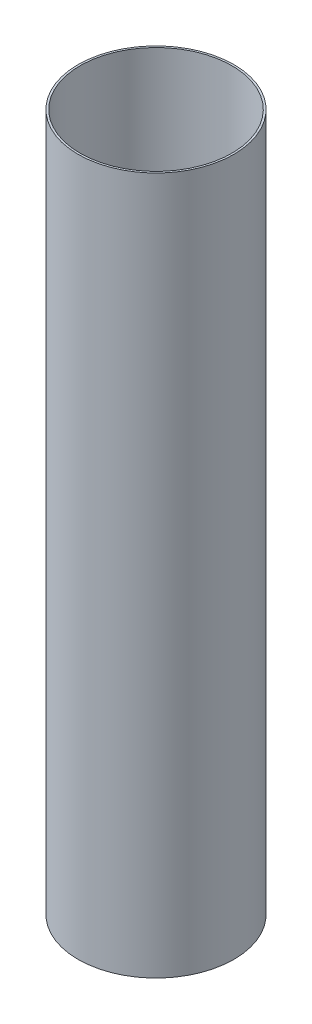
ISO-10303-21;
HEADER;
FILE_DESCRIPTION(('STEP AP214'),'2;1');
FILE_NAME('part.step','',(''),(''),'','','');
FILE_SCHEMA(('AUTOMOTIVE_DESIGN { 1 0 10303 214 1 1 1 1 }'));
ENDSEC;
DATA;
#1=APPLICATION_CONTEXT('core data for automotive mechanical design processes');
#2=APPLICATION_PROTOCOL_DEFINITION('international standard','automotive_design',2000,#1);
#3=PRODUCT_CONTEXT('',#1,'mechanical');
#4=PRODUCT('Part','Part','',(#3));
#5=PRODUCT_RELATED_PRODUCT_CATEGORY('part','',(#4));
#6=PRODUCT_DEFINITION_FORMATION('','',#4);
#7=PRODUCT_DEFINITION_CONTEXT('part definition',#1,'design');
#8=PRODUCT_DEFINITION('design','',#6,#7);
#9=PRODUCT_DEFINITION_SHAPE('','',#8);
#10=(LENGTH_UNIT() NAMED_UNIT(*) SI_UNIT(.MILLI.,.METRE.));
#11=(NAMED_UNIT(*) PLANE_ANGLE_UNIT() SI_UNIT($,.RADIAN.));
#12=(NAMED_UNIT(*) SI_UNIT($,.STERADIAN.) SOLID_ANGLE_UNIT());
#13=UNCERTAINTY_MEASURE_WITH_UNIT(LENGTH_MEASURE(1.E-05),#10,'distance_accuracy_value','');
#14=(GEOMETRIC_REPRESENTATION_CONTEXT(3) GLOBAL_UNCERTAINTY_ASSIGNED_CONTEXT((#13)) GLOBAL_UNIT_ASSIGNED_CONTEXT((#10,
#11,#12)) REPRESENTATION_CONTEXT('',''));
#15=CARTESIAN_POINT('',(0.,0.,0.));
#16=DIRECTION('',(0.,0.,1.));
#17=DIRECTION('',(1.,0.,0.));
#18=AXIS2_PLACEMENT_3D('',#15,#16,#17);
#19=CARTESIAN_POINT('',(76.2,0.,0.));
#20=DIRECTION('',(0.,1.,0.));
#21=DIRECTION('',(0.,0.,1.));
#22=AXIS2_PLACEMENT_3D('',#19,#20,#21);
#23=PLANE('',#22);
#24=CARTESIAN_POINT('',(0.,0.,0.));
#25=DIRECTION('',(0.,1.,0.));
#26=DIRECTION('',(0.,0.,1.));
#27=AXIS2_PLACEMENT_3D('',#24,#25,#26);
#28=CIRCLE('',#27,78.16);
#29=CARTESIAN_POINT('',(0.,0.,78.16));
#30=VERTEX_POINT('',#29);
#31=EDGE_CURVE('E10',#30,#30,#28,.T.);
#32=ORIENTED_EDGE('',*,*,#31,.F.);
#33=EDGE_LOOP('',(#32));
#34=FACE_BOUND('',#33,.T.);
#35=CARTESIAN_POINT('',(0.,0.,0.));
#36=DIRECTION('',(0.,1.,0.));
#37=DIRECTION('',(0.,0.,1.));
#38=AXIS2_PLACEMENT_3D('',#35,#36,#37);
#39=CIRCLE('',#38,76.2);
#40=CARTESIAN_POINT('',(0.,0.,76.2));
#41=VERTEX_POINT('',#40);
#42=EDGE_CURVE('E54',#41,#41,#39,.T.);
#43=ORIENTED_EDGE('',*,*,#42,.T.);
#44=EDGE_LOOP('',(#43));
#45=FACE_BOUND('',#44,.T.);
#46=ADVANCED_FACE('F37',(#34,#45),#23,.F.);
#47=CARTESIAN_POINT('',(0.,204.615384615384,0.));
#48=DIRECTION('',(0.,1.,0.));
#49=DIRECTION('',(0.,0.,1.));
#50=AXIS2_PLACEMENT_3D('',#47,#48,#49);
#51=CYLINDRICAL_SURFACE('',#50,78.16);
#52=CARTESIAN_POINT('',(0.,700.,0.));
#53=DIRECTION('',(0.,1.,0.));
#54=DIRECTION('',(0.,0.,1.));
#55=AXIS2_PLACEMENT_3D('',#52,#53,#54);
#56=CIRCLE('',#55,78.16);
#57=CARTESIAN_POINT('',(0.,700.,78.16));
#58=VERTEX_POINT('',#57);
#59=EDGE_CURVE('E44',#58,#58,#56,.T.);
#60=ORIENTED_EDGE('',*,*,#59,.F.);
#61=EDGE_LOOP('',(#60));
#62=FACE_BOUND('',#61,.T.);
#63=ORIENTED_EDGE('',*,*,#31,.T.);
#64=EDGE_LOOP('',(#63));
#65=FACE_BOUND('',#64,.T.);
#66=ADVANCED_FACE('F70',(#62,#65),#51,.T.);
#67=CARTESIAN_POINT('',(78.16,700.,0.));
#68=DIRECTION('',(0.,-1.,0.));
#69=DIRECTION('',(0.,0.,-1.));
#70=AXIS2_PLACEMENT_3D('',#67,#68,#69);
#71=PLANE('',#70);
#72=CARTESIAN_POINT('',(0.,700.,0.));
#73=DIRECTION('',(0.,1.,0.));
#74=DIRECTION('',(0.,0.,1.));
#75=AXIS2_PLACEMENT_3D('',#72,#73,#74);
#76=CIRCLE('',#75,76.2);
#77=CARTESIAN_POINT('',(0.,700.,76.2));
#78=VERTEX_POINT('',#77);
#79=EDGE_CURVE('E49',#78,#78,#76,.T.);
#80=ORIENTED_EDGE('',*,*,#79,.F.);
#81=EDGE_LOOP('',(#80));
#82=FACE_BOUND('',#81,.T.);
#83=ORIENTED_EDGE('',*,*,#59,.T.);
#84=EDGE_LOOP('',(#83));
#85=FACE_BOUND('',#84,.T.);
#86=ADVANCED_FACE('F65',(#82,#85),#71,.F.);
#87=CARTESIAN_POINT('',(0.,204.615384615384,0.));
#88=DIRECTION('',(0.,1.,0.));
#89=DIRECTION('',(0.,0.,1.));
#90=AXIS2_PLACEMENT_3D('',#87,#88,#89);
#91=CYLINDRICAL_SURFACE('',#90,76.2);
#92=ORIENTED_EDGE('',*,*,#42,.F.);
#93=EDGE_LOOP('',(#92));
#94=FACE_BOUND('',#93,.T.);
#95=ORIENTED_EDGE('',*,*,#79,.T.);
#96=EDGE_LOOP('',(#95));
#97=FACE_BOUND('',#96,.T.);
#98=ADVANCED_FACE('F62',(#94,#97),#91,.F.);
#99=CLOSED_SHELL('',(#46,#66,#86,#98));
#100=MANIFOLD_SOLID_BREP('B2',#99);
#101=ADVANCED_BREP_SHAPE_REPRESENTATION('',(#18,#100),#14);
#102=SHAPE_DEFINITION_REPRESENTATION(#9,#101);
ENDSEC;
END-ISO-10303-21;
